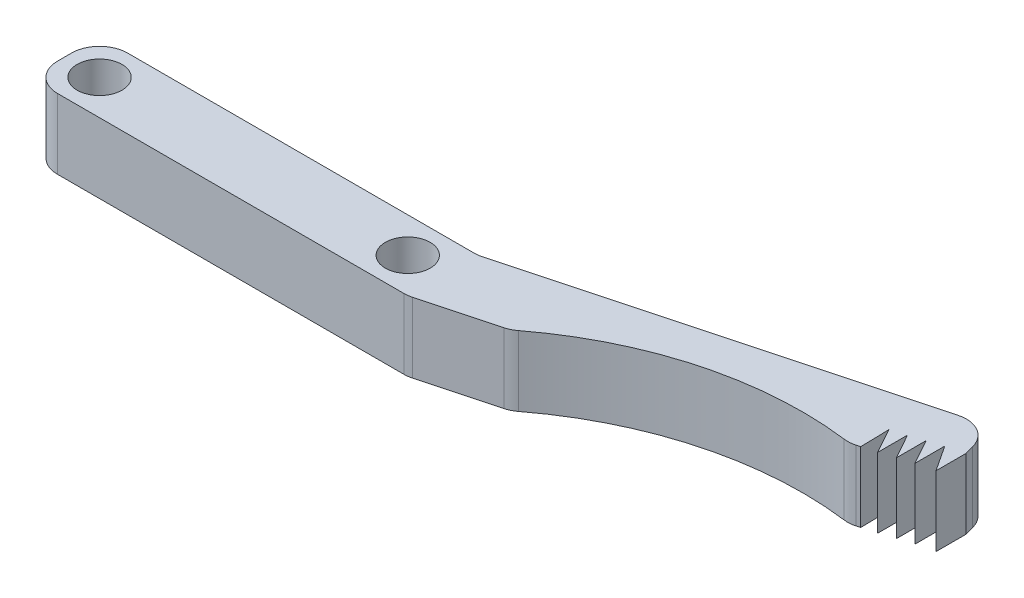
ISO-10303-21;
HEADER;
FILE_DESCRIPTION(('STEP AP214'),'2;1');
FILE_NAME('part.step','',(''),(''),'','','');
FILE_SCHEMA(('AUTOMOTIVE_DESIGN { 1 0 10303 214 1 1 1 1 }'));
ENDSEC;
DATA;
#1=APPLICATION_CONTEXT('core data for automotive mechanical design processes');
#2=APPLICATION_PROTOCOL_DEFINITION('international standard','automotive_design',2000,#1);
#3=PRODUCT_CONTEXT('',#1,'mechanical');
#4=PRODUCT('Part','Part','',(#3));
#5=PRODUCT_RELATED_PRODUCT_CATEGORY('part','',(#4));
#6=PRODUCT_DEFINITION_FORMATION('','',#4);
#7=PRODUCT_DEFINITION_CONTEXT('part definition',#1,'design');
#8=PRODUCT_DEFINITION('design','',#6,#7);
#9=PRODUCT_DEFINITION_SHAPE('','',#8);
#10=(LENGTH_UNIT() NAMED_UNIT(*) SI_UNIT(.MILLI.,.METRE.));
#11=(NAMED_UNIT(*) PLANE_ANGLE_UNIT() SI_UNIT($,.RADIAN.));
#12=(NAMED_UNIT(*) SI_UNIT($,.STERADIAN.) SOLID_ANGLE_UNIT());
#13=UNCERTAINTY_MEASURE_WITH_UNIT(LENGTH_MEASURE(1.E-05),#10,'distance_accuracy_value','');
#14=(GEOMETRIC_REPRESENTATION_CONTEXT(3) GLOBAL_UNCERTAINTY_ASSIGNED_CONTEXT((#13)) GLOBAL_UNIT_ASSIGNED_CONTEXT((#10,
#11,#12)) REPRESENTATION_CONTEXT('',''));
#15=CARTESIAN_POINT('',(0.,0.,0.));
#16=DIRECTION('',(0.,0.,1.));
#17=DIRECTION('',(1.,0.,0.));
#18=AXIS2_PLACEMENT_3D('',#15,#16,#17);
#19=CARTESIAN_POINT('',(34.7613242715723,5.,20.5891319448674));
#20=DIRECTION('',(0.,-1.,0.));
#21=DIRECTION('',(0.,0.,-1.));
#22=AXIS2_PLACEMENT_3D('',#19,#20,#21);
#23=PLANE('',#22);
#24=DIRECTION('',(-0.258819045102522,0.,-0.965925826289068));
#25=VECTOR('',#24,1.);
#26=CARTESIAN_POINT('',(42.4777747886721,5.,-10.2645713530757));
#27=LINE('',#26,#25);
#28=CARTESIAN_POINT('',(43.1761884324755,5.,-7.65805614970195));
#29=VERTEX_POINT('',#28);
#30=CARTESIAN_POINT('',(42.9954128788771,5.,-8.33271970049752));
#31=VERTEX_POINT('',#30);
#32=EDGE_CURVE('E246',#29,#31,#27,.T.);
#33=ORIENTED_EDGE('',*,*,#32,.T.);
#34=CARTESIAN_POINT('',(41.063561226299,5.,-7.81508161029247));
#35=DIRECTION('',(0.,-1.,0.));
#36=DIRECTION('',(0.,0.,-1.));
#37=AXIS2_PLACEMENT_3D('',#34,#35,#36);
#38=CIRCLE('',#37,2.);
#39=CARTESIAN_POINT('',(40.5459231360939,5.,-9.74693326287061));
#40=VERTEX_POINT('',#39);
#41=EDGE_CURVE('E355',#31,#40,#38,.F.);
#42=ORIENTED_EDGE('',*,*,#41,.T.);
#43=DIRECTION('',(-0.965925826289068,0.,0.258819045102522));
#44=VECTOR('',#43,1.);
#45=CARTESIAN_POINT('',(13.5,5.,-2.5));
#46=LINE('',#45,#44);
#47=CARTESIAN_POINT('',(13.7543330950302,5.,-2.56814834742186));
#48=VERTEX_POINT('',#47);
#49=EDGE_CURVE('E248',#40,#48,#46,.T.);
#50=ORIENTED_EDGE('',*,*,#49,.T.);
#51=CARTESIAN_POINT('',(13.2366950048252,5.,-4.5));
#52=DIRECTION('',(0.,-1.,0.));
#53=DIRECTION('',(0.,0.,-1.));
#54=AXIS2_PLACEMENT_3D('',#51,#52,#53);
#55=CIRCLE('',#54,2.);
#56=CARTESIAN_POINT('',(13.2366950048252,5.,-2.5));
#57=VERTEX_POINT('',#56);
#58=EDGE_CURVE('E11',#48,#57,#55,.T.);
#59=ORIENTED_EDGE('',*,*,#58,.T.);
#60=DIRECTION('',(-1.,0.,0.));
#61=VECTOR('',#60,1.);
#62=CARTESIAN_POINT('',(-13.5,5.,-2.5));
#63=LINE('',#62,#61);
#64=CARTESIAN_POINT('',(-11.5,5.,-2.5));
#65=VERTEX_POINT('',#64);
#66=EDGE_CURVE('E251',#57,#65,#63,.T.);
#67=ORIENTED_EDGE('',*,*,#66,.T.);
#68=CARTESIAN_POINT('',(-11.5,5.,-0.5));
#69=DIRECTION('',(0.,-1.,0.));
#70=DIRECTION('',(0.,0.,-1.));
#71=AXIS2_PLACEMENT_3D('',#68,#69,#70);
#72=CIRCLE('',#71,2.);
#73=CARTESIAN_POINT('',(-13.5,5.,-0.500000000000001));
#74=VERTEX_POINT('',#73);
#75=EDGE_CURVE('E348',#65,#74,#72,.F.);
#76=ORIENTED_EDGE('',*,*,#75,.T.);
#77=DIRECTION('',(0.,0.,1.));
#78=VECTOR('',#77,1.);
#79=CARTESIAN_POINT('',(-13.5,5.,-2.5));
#80=LINE('',#79,#78);
#81=CARTESIAN_POINT('',(-13.5,5.,0.499999999999999));
#82=VERTEX_POINT('',#81);
#83=EDGE_CURVE('E254',#74,#82,#80,.T.);
#84=ORIENTED_EDGE('',*,*,#83,.T.);
#85=CARTESIAN_POINT('',(-11.5,5.,0.5));
#86=DIRECTION('',(0.,-1.,0.));
#87=DIRECTION('',(0.,0.,-1.));
#88=AXIS2_PLACEMENT_3D('',#85,#86,#87);
#89=CIRCLE('',#88,2.);
#90=CARTESIAN_POINT('',(-11.5,5.,2.5));
#91=VERTEX_POINT('',#90);
#92=EDGE_CURVE('E61',#82,#91,#89,.F.);
#93=ORIENTED_EDGE('',*,*,#92,.T.);
#94=DIRECTION('',(1.,0.,0.));
#95=VECTOR('',#94,1.);
#96=CARTESIAN_POINT('',(-13.5,5.,2.5));
#97=LINE('',#96,#95);
#98=CARTESIAN_POINT('',(13.2366950048252,5.,2.5));
#99=VERTEX_POINT('',#98);
#100=EDGE_CURVE('E256',#91,#99,#97,.T.);
#101=ORIENTED_EDGE('',*,*,#100,.T.);
#102=CARTESIAN_POINT('',(13.2366950048252,5.,0.5));
#103=DIRECTION('',(0.,-1.,0.));
#104=DIRECTION('',(0.,0.,-1.));
#105=AXIS2_PLACEMENT_3D('',#102,#103,#104);
#106=CIRCLE('',#105,2.);
#107=CARTESIAN_POINT('',(13.7543330950302,5.,2.43185165257814));
#108=VERTEX_POINT('',#107);
#109=EDGE_CURVE('E350',#99,#108,#106,.F.);
#110=ORIENTED_EDGE('',*,*,#109,.T.);
#111=DIRECTION('',(0.965925826289068,0.,-0.258819045102522));
#112=VECTOR('',#111,1.);
#113=CARTESIAN_POINT('',(19.2955549577344,5.,0.947085729384871));
#114=LINE('',#113,#112);
#115=CARTESIAN_POINT('',(18.9066616740376,5.,1.05128937069332));
#116=VERTEX_POINT('',#115);
#117=EDGE_CURVE('E299',#108,#116,#114,.T.);
#118=ORIENTED_EDGE('',*,*,#117,.T.);
#119=CARTESIAN_POINT('',(18.3890235838325,5.,-0.88056228188482));
#120=DIRECTION('',(0.,-1.,0.));
#121=DIRECTION('',(0.,0.,-1.));
#122=AXIS2_PLACEMENT_3D('',#119,#120,#121);
#123=CIRCLE('',#122,2.);
#124=CARTESIAN_POINT('',(19.6017865977392,5.,0.709785438615346));
#125=VERTEX_POINT('',#124);
#126=EDGE_CURVE('E352',#116,#125,#123,.F.);
#127=ORIENTED_EDGE('',*,*,#126,.T.);
#128=CARTESIAN_POINT('',(34.7613242715723,5.,20.5891319448674));
#129=DIRECTION('',(0.,-1.,0.));
#130=DIRECTION('',(0.,0.,-1.));
#131=AXIS2_PLACEMENT_3D('',#128,#129,#130);
#132=CIRCLE('',#131,25.);
#133=CARTESIAN_POINT('',(37.9501957536129,5.,-4.20665597709686));
#134=VERTEX_POINT('',#133);
#135=EDGE_CURVE('E212',#125,#134,#132,.T.);
#136=ORIENTED_EDGE('',*,*,#135,.T.);
#137=CARTESIAN_POINT('',(38.2053054721762,5.,-6.190319010854));
#138=DIRECTION('',(0.,-1.,0.));
#139=DIRECTION('',(0.,0.,-1.));
#140=AXIS2_PLACEMENT_3D('',#137,#138,#139);
#141=CIRCLE('',#140,2.);
#142=CARTESIAN_POINT('',(38.7229435623812,5.,-4.25846735827586));
#143=VERTEX_POINT('',#142);
#144=EDGE_CURVE('E208',#134,#143,#141,.F.);
#145=ORIENTED_EDGE('',*,*,#144,.T.);
#146=DIRECTION('',(0.965925826289068,0.,-0.258819045102522));
#147=VECTOR('',#146,1.);
#148=CARTESIAN_POINT('',(39.0009276352453,5.,-4.3329529661085));
#149=LINE('',#148,#147);
#150=CARTESIAN_POINT('',(39.0009276352453,5.,-4.3329529661085));
#151=VERTEX_POINT('',#150);
#152=EDGE_CURVE('E199',#143,#151,#149,.T.);
#153=ORIENTED_EDGE('',*,*,#152,.T.);
#154=DIRECTION('',(-0.0231107143175573,0.,-0.999732911773806));
#155=VECTOR('',#154,1.);
#156=CARTESIAN_POINT('',(39.0009276352453,5.,-4.3329529661085));
#157=LINE('',#156,#155);
#158=CARTESIAN_POINT('',(38.9533575632879,5.,-6.39075896456379));
#159=VERTEX_POINT('',#158);
#160=EDGE_CURVE('E204',#151,#159,#157,.T.);
#161=ORIENTED_EDGE('',*,*,#160,.T.);
#162=DIRECTION('',(0.486678243039881,0.,0.873581300023996));
#163=VECTOR('',#162,1.);
#164=CARTESIAN_POINT('',(38.9533575632879,5.,-6.39075896456379));
#165=LINE('',#164,#163);
#166=CARTESIAN_POINT('',(39.9570492896688,5.,-4.5891449912772));
#167=VERTEX_POINT('',#166);
#168=EDGE_CURVE('E227',#159,#167,#165,.T.);
#169=ORIENTED_EDGE('',*,*,#168,.T.);
#170=DIRECTION('',(0.,0.,-1.));
#171=VECTOR('',#170,1.);
#172=CARTESIAN_POINT('',(39.9570492896688,5.,-4.5891449912772));
#173=LINE('',#172,#171);
#174=CARTESIAN_POINT('',(39.9570492896688,5.,-6.71750053622903));
#175=VERTEX_POINT('',#174);
#176=EDGE_CURVE('E229',#167,#175,#173,.T.);
#177=ORIENTED_EDGE('',*,*,#176,.T.);
#178=DIRECTION('',(0.486678243039881,0.,0.873581300023996));
#179=VECTOR('',#178,1.);
#180=CARTESIAN_POINT('',(39.9570492896688,5.,-6.71750053622903));
#181=LINE('',#180,#179);
#182=CARTESIAN_POINT('',(40.9607410160498,5.,-4.91588656294244));
#183=VERTEX_POINT('',#182);
#184=EDGE_CURVE('E234',#175,#183,#181,.T.);
#185=ORIENTED_EDGE('',*,*,#184,.T.);
#186=DIRECTION('',(0.,0.,-1.));
#187=VECTOR('',#186,1.);
#188=CARTESIAN_POINT('',(40.9607410160498,5.,-4.91588656294244));
#189=LINE('',#188,#187);
#190=CARTESIAN_POINT('',(40.9607410160498,5.,-7.04424210789427));
#191=VERTEX_POINT('',#190);
#192=EDGE_CURVE('E236',#183,#191,#189,.T.);
#193=ORIENTED_EDGE('',*,*,#192,.T.);
#194=DIRECTION('',(0.486678243039882,0.,0.873581300023995));
#195=VECTOR('',#194,1.);
#196=CARTESIAN_POINT('',(40.9607410160498,5.,-7.04424210789427));
#197=LINE('',#196,#195);
#198=CARTESIAN_POINT('',(41.9644327424308,5.,-5.24262813460768));
#199=VERTEX_POINT('',#198);
#200=EDGE_CURVE('E238',#191,#199,#197,.T.);
#201=ORIENTED_EDGE('',*,*,#200,.T.);
#202=DIRECTION('',(0.,0.,-1.));
#203=VECTOR('',#202,1.);
#204=CARTESIAN_POINT('',(41.9644327424308,5.,-5.24262813460768));
#205=LINE('',#204,#203);
#206=CARTESIAN_POINT('',(41.9644327424308,5.,-7.3709836795595));
#207=VERTEX_POINT('',#206);
#208=EDGE_CURVE('E240',#199,#207,#205,.T.);
#209=ORIENTED_EDGE('',*,*,#208,.T.);
#210=DIRECTION('',(0.549738474881785,0.,0.835336823822971));
#211=VECTOR('',#210,1.);
#212=CARTESIAN_POINT('',(41.9644327424308,5.,-7.3709836795595));
#213=LINE('',#212,#211);
#214=CARTESIAN_POINT('',(43.1761884324755,5.,-5.52970060475013));
#215=VERTEX_POINT('',#214);
#216=EDGE_CURVE('E242',#207,#215,#213,.T.);
#217=ORIENTED_EDGE('',*,*,#216,.T.);
#218=DIRECTION('',(0.,0.,-1.));
#219=VECTOR('',#218,1.);
#220=CARTESIAN_POINT('',(43.1761884324755,5.,-5.52970060475013));
#221=LINE('',#220,#219);
#222=EDGE_CURVE('E244',#215,#29,#221,.T.);
#223=ORIENTED_EDGE('',*,*,#222,.T.);
#224=EDGE_LOOP('',(#33,#42,#50,#59,#67,#76,#84,#93,#101,#110,#118,#127,#136,#145,#153,#161,#169,
#177,#185,#193,#201,#209,#217,#223));
#225=FACE_BOUND('',#224,.T.);
#226=CARTESIAN_POINT('',(-11.,5.,0.));
#227=DIRECTION('',(0.,1.,0.));
#228=DIRECTION('',(0.,0.,1.));
#229=AXIS2_PLACEMENT_3D('',#226,#227,#228);
#230=CIRCLE('',#229,1.6);
#231=CARTESIAN_POINT('',(-11.,5.,1.6));
#232=VERTEX_POINT('',#231);
#233=EDGE_CURVE('E263',#232,#232,#230,.T.);
#234=ORIENTED_EDGE('',*,*,#233,.F.);
#235=EDGE_LOOP('',(#234));
#236=FACE_BOUND('',#235,.T.);
#237=CARTESIAN_POINT('',(11.,5.,0.));
#238=DIRECTION('',(0.,1.,0.));
#239=DIRECTION('',(0.,0.,-1.));
#240=AXIS2_PLACEMENT_3D('',#237,#238,#239);
#241=CIRCLE('',#240,1.6);
#242=CARTESIAN_POINT('',(11.,5.,-1.6));
#243=VERTEX_POINT('',#242);
#244=EDGE_CURVE('E424',#243,#243,#241,.T.);
#245=ORIENTED_EDGE('',*,*,#244,.F.);
#246=EDGE_LOOP('',(#245));
#247=FACE_BOUND('',#246,.T.);
#248=ADVANCED_FACE('F39',(#225,#236,#247),#23,.F.);
#249=CARTESIAN_POINT('',(34.7613242715723,0.,20.5891319448674));
#250=DIRECTION('',(0.,-1.,0.));
#251=DIRECTION('',(0.,0.,-1.));
#252=AXIS2_PLACEMENT_3D('',#249,#250,#251);
#253=PLANE('',#252);
#254=CARTESIAN_POINT('',(-11.,0.,0.));
#255=DIRECTION('',(0.,1.,0.));
#256=DIRECTION('',(0.,0.,1.));
#257=AXIS2_PLACEMENT_3D('',#254,#255,#256);
#258=CIRCLE('',#257,1.6);
#259=CARTESIAN_POINT('',(-11.,0.,1.6));
#260=VERTEX_POINT('',#259);
#261=EDGE_CURVE('E421',#260,#260,#258,.T.);
#262=ORIENTED_EDGE('',*,*,#261,.T.);
#263=EDGE_LOOP('',(#262));
#264=FACE_BOUND('',#263,.T.);
#265=DIRECTION('',(-0.965925826289068,0.,0.258819045102522));
#266=VECTOR('',#265,1.);
#267=CARTESIAN_POINT('',(13.5,0.,-2.5));
#268=LINE('',#267,#266);
#269=CARTESIAN_POINT('',(40.5459231360939,0.,-9.74693326287061));
#270=VERTEX_POINT('',#269);
#271=CARTESIAN_POINT('',(13.7543330950302,0.,-2.56814834742186));
#272=VERTEX_POINT('',#271);
#273=EDGE_CURVE('E288',#270,#272,#268,.T.);
#274=ORIENTED_EDGE('',*,*,#273,.F.);
#275=CARTESIAN_POINT('',(41.063561226299,0.,-7.81508161029247));
#276=DIRECTION('',(0.,-1.,0.));
#277=DIRECTION('',(0.,0.,-1.));
#278=AXIS2_PLACEMENT_3D('',#275,#276,#277);
#279=CIRCLE('',#278,2.);
#280=CARTESIAN_POINT('',(42.9954128788771,0.,-8.33271970049752));
#281=VERTEX_POINT('',#280);
#282=EDGE_CURVE('E343',#270,#281,#279,.T.);
#283=ORIENTED_EDGE('',*,*,#282,.T.);
#284=DIRECTION('',(-0.258819045102522,0.,-0.965925826289068));
#285=VECTOR('',#284,1.);
#286=CARTESIAN_POINT('',(42.4777747886721,0.,-10.2645713530757));
#287=LINE('',#286,#285);
#288=CARTESIAN_POINT('',(43.1761884324755,0.,-7.65805614970195));
#289=VERTEX_POINT('',#288);
#290=EDGE_CURVE('E285',#289,#281,#287,.T.);
#291=ORIENTED_EDGE('',*,*,#290,.F.);
#292=DIRECTION('',(0.,0.,-1.));
#293=VECTOR('',#292,1.);
#294=CARTESIAN_POINT('',(43.1761884324755,0.,-5.52970060475013));
#295=LINE('',#294,#293);
#296=CARTESIAN_POINT('',(43.1761884324755,0.,-5.52970060475013));
#297=VERTEX_POINT('',#296);
#298=EDGE_CURVE('E283',#297,#289,#295,.T.);
#299=ORIENTED_EDGE('',*,*,#298,.F.);
#300=DIRECTION('',(0.549738474881785,0.,0.835336823822971));
#301=VECTOR('',#300,1.);
#302=CARTESIAN_POINT('',(41.9644327424308,0.,-7.3709836795595));
#303=LINE('',#302,#301);
#304=CARTESIAN_POINT('',(41.9644327424308,0.,-7.3709836795595));
#305=VERTEX_POINT('',#304);
#306=EDGE_CURVE('E281',#305,#297,#303,.T.);
#307=ORIENTED_EDGE('',*,*,#306,.F.);
#308=DIRECTION('',(0.,0.,-1.));
#309=VECTOR('',#308,1.);
#310=CARTESIAN_POINT('',(41.9644327424308,0.,-5.24262813460768));
#311=LINE('',#310,#309);
#312=CARTESIAN_POINT('',(41.9644327424308,0.,-5.24262813460768));
#313=VERTEX_POINT('',#312);
#314=EDGE_CURVE('E279',#313,#305,#311,.T.);
#315=ORIENTED_EDGE('',*,*,#314,.F.);
#316=DIRECTION('',(0.486678243039882,0.,0.873581300023995));
#317=VECTOR('',#316,1.);
#318=CARTESIAN_POINT('',(40.9607410160498,0.,-7.04424210789427));
#319=LINE('',#318,#317);
#320=CARTESIAN_POINT('',(40.9607410160498,0.,-7.04424210789427));
#321=VERTEX_POINT('',#320);
#322=EDGE_CURVE('E277',#321,#313,#319,.T.);
#323=ORIENTED_EDGE('',*,*,#322,.F.);
#324=DIRECTION('',(0.,0.,-1.));
#325=VECTOR('',#324,1.);
#326=CARTESIAN_POINT('',(40.9607410160498,0.,-4.91588656294244));
#327=LINE('',#326,#325);
#328=CARTESIAN_POINT('',(40.9607410160498,0.,-4.91588656294244));
#329=VERTEX_POINT('',#328);
#330=EDGE_CURVE('E275',#329,#321,#327,.T.);
#331=ORIENTED_EDGE('',*,*,#330,.F.);
#332=DIRECTION('',(0.486678243039881,0.,0.873581300023996));
#333=VECTOR('',#332,1.);
#334=CARTESIAN_POINT('',(39.9570492896688,0.,-6.71750053622903));
#335=LINE('',#334,#333);
#336=CARTESIAN_POINT('',(39.9570492896688,0.,-6.71750053622903));
#337=VERTEX_POINT('',#336);
#338=EDGE_CURVE('E273',#337,#329,#335,.T.);
#339=ORIENTED_EDGE('',*,*,#338,.F.);
#340=DIRECTION('',(0.,0.,-1.));
#341=VECTOR('',#340,1.);
#342=CARTESIAN_POINT('',(39.9570492896688,0.,-4.5891449912772));
#343=LINE('',#342,#341);
#344=CARTESIAN_POINT('',(39.9570492896688,0.,-4.5891449912772));
#345=VERTEX_POINT('',#344);
#346=EDGE_CURVE('E271',#345,#337,#343,.T.);
#347=ORIENTED_EDGE('',*,*,#346,.F.);
#348=DIRECTION('',(0.486678243039881,0.,0.873581300023996));
#349=VECTOR('',#348,1.);
#350=CARTESIAN_POINT('',(38.9533575632879,0.,-6.39075896456379));
#351=LINE('',#350,#349);
#352=CARTESIAN_POINT('',(38.9533575632879,0.,-6.39075896456379));
#353=VERTEX_POINT('',#352);
#354=EDGE_CURVE('E269',#353,#345,#351,.T.);
#355=ORIENTED_EDGE('',*,*,#354,.F.);
#356=DIRECTION('',(-0.0231107143175573,0.,-0.999732911773806));
#357=VECTOR('',#356,1.);
#358=CARTESIAN_POINT('',(39.0009276352453,0.,-4.3329529661085));
#359=LINE('',#358,#357);
#360=CARTESIAN_POINT('',(39.0009276352453,0.,-4.3329529661085));
#361=VERTEX_POINT('',#360);
#362=EDGE_CURVE('E267',#361,#353,#359,.T.);
#363=ORIENTED_EDGE('',*,*,#362,.F.);
#364=DIRECTION('',(0.965925826289068,0.,-0.258819045102522));
#365=VECTOR('',#364,1.);
#366=CARTESIAN_POINT('',(39.0009276352453,0.,-4.3329529661085));
#367=LINE('',#366,#365);
#368=CARTESIAN_POINT('',(38.7229435623812,0.,-4.25846735827586));
#369=VERTEX_POINT('',#368);
#370=EDGE_CURVE('E218',#369,#361,#367,.T.);
#371=ORIENTED_EDGE('',*,*,#370,.F.);
#372=CARTESIAN_POINT('',(38.2053054721762,0.,-6.190319010854));
#373=DIRECTION('',(0.,-1.,0.));
#374=DIRECTION('',(0.,0.,-1.));
#375=AXIS2_PLACEMENT_3D('',#372,#373,#374);
#376=CIRCLE('',#375,2.);
#377=CARTESIAN_POINT('',(37.9501957536129,0.,-4.20665597709686));
#378=VERTEX_POINT('',#377);
#379=EDGE_CURVE('E341',#369,#378,#376,.T.);
#380=ORIENTED_EDGE('',*,*,#379,.T.);
#381=CARTESIAN_POINT('',(34.7613242715723,0.,20.5891319448674));
#382=DIRECTION('',(0.,-1.,0.));
#383=DIRECTION('',(0.,0.,-1.));
#384=AXIS2_PLACEMENT_3D('',#381,#382,#383);
#385=CIRCLE('',#384,25.);
#386=CARTESIAN_POINT('',(19.6017865977392,0.,0.709785438615346));
#387=VERTEX_POINT('',#386);
#388=EDGE_CURVE('E262',#387,#378,#385,.T.);
#389=ORIENTED_EDGE('',*,*,#388,.F.);
#390=CARTESIAN_POINT('',(18.3890235838325,0.,-0.88056228188482));
#391=DIRECTION('',(0.,-1.,0.));
#392=DIRECTION('',(0.,0.,-1.));
#393=AXIS2_PLACEMENT_3D('',#390,#391,#392);
#394=CIRCLE('',#393,2.);
#395=CARTESIAN_POINT('',(18.9066616740376,0.,1.05128937069332));
#396=VERTEX_POINT('',#395);
#397=EDGE_CURVE('E339',#387,#396,#394,.T.);
#398=ORIENTED_EDGE('',*,*,#397,.T.);
#399=DIRECTION('',(0.965925826289068,0.,-0.258819045102522));
#400=VECTOR('',#399,1.);
#401=CARTESIAN_POINT('',(19.2955549577344,0.,0.947085729384871));
#402=LINE('',#401,#400);
#403=CARTESIAN_POINT('',(13.7543330950302,0.,2.43185165257814));
#404=VERTEX_POINT('',#403);
#405=EDGE_CURVE('E259',#404,#396,#402,.T.);
#406=ORIENTED_EDGE('',*,*,#405,.F.);
#407=CARTESIAN_POINT('',(13.2366950048252,0.,0.5));
#408=DIRECTION('',(0.,-1.,0.));
#409=DIRECTION('',(0.,0.,-1.));
#410=AXIS2_PLACEMENT_3D('',#407,#408,#409);
#411=CIRCLE('',#410,2.);
#412=CARTESIAN_POINT('',(13.2366950048252,0.,2.5));
#413=VERTEX_POINT('',#412);
#414=EDGE_CURVE('E337',#404,#413,#411,.T.);
#415=ORIENTED_EDGE('',*,*,#414,.T.);
#416=DIRECTION('',(1.,0.,0.));
#417=VECTOR('',#416,1.);
#418=CARTESIAN_POINT('',(-13.5,0.,2.5));
#419=LINE('',#418,#417);
#420=CARTESIAN_POINT('',(-11.5,0.,2.5));
#421=VERTEX_POINT('',#420);
#422=EDGE_CURVE('E297',#421,#413,#419,.T.);
#423=ORIENTED_EDGE('',*,*,#422,.F.);
#424=CARTESIAN_POINT('',(-11.5,0.,0.5));
#425=DIRECTION('',(0.,-1.,0.));
#426=DIRECTION('',(0.,0.,-1.));
#427=AXIS2_PLACEMENT_3D('',#424,#425,#426);
#428=CIRCLE('',#427,2.);
#429=CARTESIAN_POINT('',(-13.5,0.,0.499999999999999));
#430=VERTEX_POINT('',#429);
#431=EDGE_CURVE('E333',#421,#430,#428,.T.);
#432=ORIENTED_EDGE('',*,*,#431,.T.);
#433=DIRECTION('',(0.,0.,1.));
#434=VECTOR('',#433,1.);
#435=CARTESIAN_POINT('',(-13.5,0.,-2.5));
#436=LINE('',#435,#434);
#437=CARTESIAN_POINT('',(-13.5,0.,-0.500000000000001));
#438=VERTEX_POINT('',#437);
#439=EDGE_CURVE('E294',#438,#430,#436,.T.);
#440=ORIENTED_EDGE('',*,*,#439,.F.);
#441=CARTESIAN_POINT('',(-11.5,0.,-0.5));
#442=DIRECTION('',(0.,-1.,0.));
#443=DIRECTION('',(0.,0.,-1.));
#444=AXIS2_PLACEMENT_3D('',#441,#442,#443);
#445=CIRCLE('',#444,2.);
#446=CARTESIAN_POINT('',(-11.5,0.,-2.5));
#447=VERTEX_POINT('',#446);
#448=EDGE_CURVE('E335',#438,#447,#445,.T.);
#449=ORIENTED_EDGE('',*,*,#448,.T.);
#450=DIRECTION('',(-1.,0.,0.));
#451=VECTOR('',#450,1.);
#452=CARTESIAN_POINT('',(-13.5,0.,-2.5));
#453=LINE('',#452,#451);
#454=CARTESIAN_POINT('',(13.2366950048252,0.,-2.5));
#455=VERTEX_POINT('',#454);
#456=EDGE_CURVE('E291',#455,#447,#453,.T.);
#457=ORIENTED_EDGE('',*,*,#456,.F.);
#458=CARTESIAN_POINT('',(13.2366950048252,0.,-4.5));
#459=DIRECTION('',(0.,-1.,0.));
#460=DIRECTION('',(0.,0.,-1.));
#461=AXIS2_PLACEMENT_3D('',#458,#459,#460);
#462=CIRCLE('',#461,2.);
#463=EDGE_CURVE('E47',#455,#272,#462,.F.);
#464=ORIENTED_EDGE('',*,*,#463,.T.);
#465=EDGE_LOOP('',(#274,#283,#291,#299,#307,#315,#323,#331,#339,#347,#355,#363,#371,#380,#389,
#398,#406,#415,#423,#432,#440,#449,#457,#464));
#466=FACE_BOUND('',#465,.T.);
#467=CARTESIAN_POINT('',(11.,0.,0.));
#468=DIRECTION('',(0.,1.,0.));
#469=DIRECTION('',(0.,0.,-1.));
#470=AXIS2_PLACEMENT_3D('',#467,#468,#469);
#471=CIRCLE('',#470,1.6);
#472=CARTESIAN_POINT('',(11.,0.,-1.6));
#473=VERTEX_POINT('',#472);
#474=EDGE_CURVE('E427',#473,#473,#471,.T.);
#475=ORIENTED_EDGE('',*,*,#474,.T.);
#476=EDGE_LOOP('',(#475));
#477=FACE_BOUND('',#476,.T.);
#478=ADVANCED_FACE('F380',(#264,#466,#477),#253,.T.);
#479=CARTESIAN_POINT('',(19.2955549577344,5.,0.947085729384871));
#480=DIRECTION('',(-0.258819045102522,0.,-0.965925826289068));
#481=DIRECTION('',(-0.965925826289068,0.,0.258819045102522));
#482=AXIS2_PLACEMENT_3D('',#479,#480,#481);
#483=PLANE('',#482);
#484=ORIENTED_EDGE('',*,*,#405,.T.);
#485=DIRECTION('',(0.,-1.,0.));
#486=VECTOR('',#485,1.);
#487=CARTESIAN_POINT('',(18.9066616740376,5.,1.05128937069332));
#488=LINE('',#487,#486);
#489=EDGE_CURVE('E367',#396,#116,#488,.F.);
#490=ORIENTED_EDGE('',*,*,#489,.T.);
#491=ORIENTED_EDGE('',*,*,#117,.F.);
#492=DIRECTION('',(0.,-1.,0.));
#493=VECTOR('',#492,1.);
#494=CARTESIAN_POINT('',(13.7543330950302,5.,2.43185165257814));
#495=LINE('',#494,#493);
#496=EDGE_CURVE('E364',#108,#404,#495,.T.);
#497=ORIENTED_EDGE('',*,*,#496,.T.);
#498=EDGE_LOOP('',(#484,#490,#491,#497));
#499=FACE_BOUND('',#498,.T.);
#500=ADVANCED_FACE('F415',(#499),#483,.F.);
#501=CARTESIAN_POINT('',(34.7613242715723,5.,20.5891319448674));
#502=DIRECTION('',(0.,-1.,0.));
#503=DIRECTION('',(0.,0.,-1.));
#504=AXIS2_PLACEMENT_3D('',#501,#502,#503);
#505=CYLINDRICAL_SURFACE('',#504,25.);
#506=ORIENTED_EDGE('',*,*,#388,.T.);
#507=DIRECTION('',(0.,-1.,0.));
#508=VECTOR('',#507,1.);
#509=CARTESIAN_POINT('',(37.9501957536129,5.,-4.20665597709686));
#510=LINE('',#509,#508);
#511=EDGE_CURVE('E362',#378,#134,#510,.F.);
#512=ORIENTED_EDGE('',*,*,#511,.T.);
#513=ORIENTED_EDGE('',*,*,#135,.F.);
#514=DIRECTION('',(0.,-1.,0.));
#515=VECTOR('',#514,1.);
#516=CARTESIAN_POINT('',(19.6017865977392,5.,0.709785438615346));
#517=LINE('',#516,#515);
#518=EDGE_CURVE('E359',#125,#387,#517,.T.);
#519=ORIENTED_EDGE('',*,*,#518,.T.);
#520=EDGE_LOOP('',(#506,#512,#513,#519));
#521=FACE_BOUND('',#520,.T.);
#522=ADVANCED_FACE('F496',(#521),#505,.F.);
#523=CARTESIAN_POINT('',(39.0009276352453,5.,-4.3329529661085));
#524=DIRECTION('',(-0.258819045102522,0.,-0.965925826289068));
#525=DIRECTION('',(-0.965925826289068,0.,0.258819045102522));
#526=AXIS2_PLACEMENT_3D('',#523,#524,#525);
#527=PLANE('',#526);
#528=ORIENTED_EDGE('',*,*,#152,.F.);
#529=DIRECTION('',(0.,-1.,0.));
#530=VECTOR('',#529,1.);
#531=CARTESIAN_POINT('',(38.7229435623812,5.,-4.25846735827586));
#532=LINE('',#531,#530);
#533=EDGE_CURVE('E357',#143,#369,#532,.T.);
#534=ORIENTED_EDGE('',*,*,#533,.T.);
#535=ORIENTED_EDGE('',*,*,#370,.T.);
#536=DIRECTION('',(0.,-1.,0.));
#537=VECTOR('',#536,1.);
#538=CARTESIAN_POINT('',(39.0009276352453,5.,-4.3329529661085));
#539=LINE('',#538,#537);
#540=EDGE_CURVE('E215',#151,#361,#539,.T.);
#541=ORIENTED_EDGE('',*,*,#540,.F.);
#542=EDGE_LOOP('',(#528,#534,#535,#541));
#543=FACE_BOUND('',#542,.T.);
#544=ADVANCED_FACE('F216',(#543),#527,.F.);
#545=CARTESIAN_POINT('',(39.0009276352453,5.,-4.3329529661085));
#546=DIRECTION('',(-0.999732911773806,0.,0.0231107143175573));
#547=DIRECTION('',(0.0231107143175573,0.,0.999732911773806));
#548=AXIS2_PLACEMENT_3D('',#545,#546,#547);
#549=PLANE('',#548);
#550=ORIENTED_EDGE('',*,*,#362,.T.);
#551=DIRECTION('',(0.,-1.,0.));
#552=VECTOR('',#551,1.);
#553=CARTESIAN_POINT('',(38.9533575632879,5.,-6.39075896456379));
#554=LINE('',#553,#552);
#555=EDGE_CURVE('E222',#159,#353,#554,.T.);
#556=ORIENTED_EDGE('',*,*,#555,.F.);
#557=ORIENTED_EDGE('',*,*,#160,.F.);
#558=ORIENTED_EDGE('',*,*,#540,.T.);
#559=EDGE_LOOP('',(#550,#556,#557,#558));
#560=FACE_BOUND('',#559,.T.);
#561=ADVANCED_FACE('F224',(#560),#549,.F.);
#562=CARTESIAN_POINT('',(38.9533575632879,5.,-6.39075896456379));
#563=DIRECTION('',(0.873581300023996,0.,-0.486678243039881));
#564=DIRECTION('',(-0.486678243039881,0.,-0.873581300023996));
#565=AXIS2_PLACEMENT_3D('',#562,#563,#564);
#566=PLANE('',#565);
#567=ORIENTED_EDGE('',*,*,#354,.T.);
#568=DIRECTION('',(0.,-1.,0.));
#569=VECTOR('',#568,1.);
#570=CARTESIAN_POINT('',(39.9570492896688,5.,-4.5891449912772));
#571=LINE('',#570,#569);
#572=EDGE_CURVE('E320',#167,#345,#571,.T.);
#573=ORIENTED_EDGE('',*,*,#572,.F.);
#574=ORIENTED_EDGE('',*,*,#168,.F.);
#575=ORIENTED_EDGE('',*,*,#555,.T.);
#576=EDGE_LOOP('',(#567,#573,#574,#575));
#577=FACE_BOUND('',#576,.T.);
#578=ADVANCED_FACE('F487',(#577),#566,.F.);
#579=CARTESIAN_POINT('',(39.9570492896688,5.,-4.5891449912772));
#580=DIRECTION('',(-1.,0.,0.));
#581=DIRECTION('',(0.,0.,1.));
#582=AXIS2_PLACEMENT_3D('',#579,#580,#581);
#583=PLANE('',#582);
#584=ORIENTED_EDGE('',*,*,#346,.T.);
#585=DIRECTION('',(0.,-1.,0.));
#586=VECTOR('',#585,1.);
#587=CARTESIAN_POINT('',(39.9570492896688,5.,-6.71750053622903));
#588=LINE('',#587,#586);
#589=EDGE_CURVE('E317',#175,#337,#588,.T.);
#590=ORIENTED_EDGE('',*,*,#589,.F.);
#591=ORIENTED_EDGE('',*,*,#176,.F.);
#592=ORIENTED_EDGE('',*,*,#572,.T.);
#593=EDGE_LOOP('',(#584,#590,#591,#592));
#594=FACE_BOUND('',#593,.T.);
#595=ADVANCED_FACE('F483',(#594),#583,.F.);
#596=CARTESIAN_POINT('',(39.9570492896688,5.,-6.71750053622903));
#597=DIRECTION('',(0.873581300023996,0.,-0.486678243039881));
#598=DIRECTION('',(-0.486678243039881,0.,-0.873581300023996));
#599=AXIS2_PLACEMENT_3D('',#596,#597,#598);
#600=PLANE('',#599);
#601=ORIENTED_EDGE('',*,*,#338,.T.);
#602=DIRECTION('',(0.,-1.,0.));
#603=VECTOR('',#602,1.);
#604=CARTESIAN_POINT('',(40.9607410160498,5.,-4.91588656294244));
#605=LINE('',#604,#603);
#606=EDGE_CURVE('E314',#183,#329,#605,.T.);
#607=ORIENTED_EDGE('',*,*,#606,.F.);
#608=ORIENTED_EDGE('',*,*,#184,.F.);
#609=ORIENTED_EDGE('',*,*,#589,.T.);
#610=EDGE_LOOP('',(#601,#607,#608,#609));
#611=FACE_BOUND('',#610,.T.);
#612=ADVANCED_FACE('F479',(#611),#600,.F.);
#613=CARTESIAN_POINT('',(40.9607410160498,5.,-4.91588656294244));
#614=DIRECTION('',(-1.,0.,0.));
#615=DIRECTION('',(0.,0.,1.));
#616=AXIS2_PLACEMENT_3D('',#613,#614,#615);
#617=PLANE('',#616);
#618=ORIENTED_EDGE('',*,*,#330,.T.);
#619=DIRECTION('',(0.,-1.,0.));
#620=VECTOR('',#619,1.);
#621=CARTESIAN_POINT('',(40.9607410160498,5.,-7.04424210789427));
#622=LINE('',#621,#620);
#623=EDGE_CURVE('E311',#191,#321,#622,.T.);
#624=ORIENTED_EDGE('',*,*,#623,.F.);
#625=ORIENTED_EDGE('',*,*,#192,.F.);
#626=ORIENTED_EDGE('',*,*,#606,.T.);
#627=EDGE_LOOP('',(#618,#624,#625,#626));
#628=FACE_BOUND('',#627,.T.);
#629=ADVANCED_FACE('F475',(#628),#617,.F.);
#630=CARTESIAN_POINT('',(40.9607410160498,5.,-7.04424210789427));
#631=DIRECTION('',(0.873581300023995,0.,-0.486678243039882));
#632=DIRECTION('',(-0.486678243039882,0.,-0.873581300023995));
#633=AXIS2_PLACEMENT_3D('',#630,#631,#632);
#634=PLANE('',#633);
#635=ORIENTED_EDGE('',*,*,#322,.T.);
#636=DIRECTION('',(0.,-1.,0.));
#637=VECTOR('',#636,1.);
#638=CARTESIAN_POINT('',(41.9644327424308,5.,-5.24262813460768));
#639=LINE('',#638,#637);
#640=EDGE_CURVE('E308',#199,#313,#639,.T.);
#641=ORIENTED_EDGE('',*,*,#640,.F.);
#642=ORIENTED_EDGE('',*,*,#200,.F.);
#643=ORIENTED_EDGE('',*,*,#623,.T.);
#644=EDGE_LOOP('',(#635,#641,#642,#643));
#645=FACE_BOUND('',#644,.T.);
#646=ADVANCED_FACE('F471',(#645),#634,.F.);
#647=CARTESIAN_POINT('',(41.9644327424308,5.,-5.24262813460768));
#648=DIRECTION('',(-1.,0.,0.));
#649=DIRECTION('',(0.,0.,1.));
#650=AXIS2_PLACEMENT_3D('',#647,#648,#649);
#651=PLANE('',#650);
#652=ORIENTED_EDGE('',*,*,#314,.T.);
#653=DIRECTION('',(0.,-1.,0.));
#654=VECTOR('',#653,1.);
#655=CARTESIAN_POINT('',(41.9644327424308,5.,-7.3709836795595));
#656=LINE('',#655,#654);
#657=EDGE_CURVE('E305',#207,#305,#656,.T.);
#658=ORIENTED_EDGE('',*,*,#657,.F.);
#659=ORIENTED_EDGE('',*,*,#208,.F.);
#660=ORIENTED_EDGE('',*,*,#640,.T.);
#661=EDGE_LOOP('',(#652,#658,#659,#660));
#662=FACE_BOUND('',#661,.T.);
#663=ADVANCED_FACE('F467',(#662),#651,.F.);
#664=CARTESIAN_POINT('',(41.9644327424308,5.,-7.3709836795595));
#665=DIRECTION('',(0.835336823822971,0.,-0.549738474881785));
#666=DIRECTION('',(-0.549738474881785,0.,-0.835336823822971));
#667=AXIS2_PLACEMENT_3D('',#664,#665,#666);
#668=PLANE('',#667);
#669=ORIENTED_EDGE('',*,*,#306,.T.);
#670=DIRECTION('',(0.,-1.,0.));
#671=VECTOR('',#670,1.);
#672=CARTESIAN_POINT('',(43.1761884324755,5.,-5.52970060475013));
#673=LINE('',#672,#671);
#674=EDGE_CURVE('E302',#215,#297,#673,.T.);
#675=ORIENTED_EDGE('',*,*,#674,.F.);
#676=ORIENTED_EDGE('',*,*,#216,.F.);
#677=ORIENTED_EDGE('',*,*,#657,.T.);
#678=EDGE_LOOP('',(#669,#675,#676,#677));
#679=FACE_BOUND('',#678,.T.);
#680=ADVANCED_FACE('F463',(#679),#668,.F.);
#681=CARTESIAN_POINT('',(43.1761884324755,5.,-5.52970060475013));
#682=DIRECTION('',(-1.,0.,0.));
#683=DIRECTION('',(0.,0.,1.));
#684=AXIS2_PLACEMENT_3D('',#681,#682,#683);
#685=PLANE('',#684);
#686=ORIENTED_EDGE('',*,*,#298,.T.);
#687=DIRECTION('',(0.,-1.,0.));
#688=VECTOR('',#687,1.);
#689=CARTESIAN_POINT('',(43.1761884324755,5.,-7.65805614970195));
#690=LINE('',#689,#688);
#691=EDGE_CURVE('E258',#29,#289,#690,.T.);
#692=ORIENTED_EDGE('',*,*,#691,.F.);
#693=ORIENTED_EDGE('',*,*,#222,.F.);
#694=ORIENTED_EDGE('',*,*,#674,.T.);
#695=EDGE_LOOP('',(#686,#692,#693,#694));
#696=FACE_BOUND('',#695,.T.);
#697=ADVANCED_FACE('F459',(#696),#685,.F.);
#698=CARTESIAN_POINT('',(42.4777747886721,5.,-10.2645713530757));
#699=DIRECTION('',(-0.965925826289068,0.,0.258819045102522));
#700=DIRECTION('',(0.258819045102522,0.,0.965925826289068));
#701=AXIS2_PLACEMENT_3D('',#698,#699,#700);
#702=PLANE('',#701);
#703=ORIENTED_EDGE('',*,*,#290,.T.);
#704=DIRECTION('',(0.,-1.,0.));
#705=VECTOR('',#704,1.);
#706=CARTESIAN_POINT('',(42.9954128788771,5.,-8.33271970049752));
#707=LINE('',#706,#705);
#708=EDGE_CURVE('E345',#281,#31,#707,.F.);
#709=ORIENTED_EDGE('',*,*,#708,.T.);
#710=ORIENTED_EDGE('',*,*,#32,.F.);
#711=ORIENTED_EDGE('',*,*,#691,.T.);
#712=EDGE_LOOP('',(#703,#709,#710,#711));
#713=FACE_BOUND('',#712,.T.);
#714=ADVANCED_FACE('F456',(#713),#702,.F.);
#715=CARTESIAN_POINT('',(13.5,5.,-2.5));
#716=DIRECTION('',(0.258819045102522,0.,0.965925826289068));
#717=DIRECTION('',(0.965925826289068,0.,-0.258819045102522));
#718=AXIS2_PLACEMENT_3D('',#715,#716,#717);
#719=PLANE('',#718);
#720=ORIENTED_EDGE('',*,*,#273,.T.);
#721=DIRECTION('',(0.,-1.,0.));
#722=VECTOR('',#721,1.);
#723=CARTESIAN_POINT('',(13.7543330950302,5.,-2.56814834742186));
#724=LINE('',#723,#722);
#725=EDGE_CURVE('E331',#272,#48,#724,.F.);
#726=ORIENTED_EDGE('',*,*,#725,.T.);
#727=ORIENTED_EDGE('',*,*,#49,.F.);
#728=DIRECTION('',(0.,-1.,0.));
#729=VECTOR('',#728,1.);
#730=CARTESIAN_POINT('',(40.5459231360939,5.,-9.74693326287061));
#731=LINE('',#730,#729);
#732=EDGE_CURVE('E328',#40,#270,#731,.T.);
#733=ORIENTED_EDGE('',*,*,#732,.T.);
#734=EDGE_LOOP('',(#720,#726,#727,#733));
#735=FACE_BOUND('',#734,.T.);
#736=ADVANCED_FACE('F386',(#735),#719,.F.);
#737=CARTESIAN_POINT('',(-13.5,5.,-2.5));
#738=DIRECTION('',(0.,0.,1.));
#739=DIRECTION('',(1.,0.,0.));
#740=AXIS2_PLACEMENT_3D('',#737,#738,#739);
#741=PLANE('',#740);
#742=ORIENTED_EDGE('',*,*,#66,.F.);
#743=DIRECTION('',(0.,-1.,0.));
#744=VECTOR('',#743,1.);
#745=CARTESIAN_POINT('',(13.2366950048252,0.,-2.5));
#746=LINE('',#745,#744);
#747=EDGE_CURVE('E325',#57,#455,#746,.T.);
#748=ORIENTED_EDGE('',*,*,#747,.T.);
#749=ORIENTED_EDGE('',*,*,#456,.T.);
#750=DIRECTION('',(0.,-1.,0.));
#751=VECTOR('',#750,1.);
#752=CARTESIAN_POINT('',(-11.5,5.,-2.5));
#753=LINE('',#752,#751);
#754=EDGE_CURVE('E221',#447,#65,#753,.F.);
#755=ORIENTED_EDGE('',*,*,#754,.T.);
#756=EDGE_LOOP('',(#742,#748,#749,#755));
#757=FACE_BOUND('',#756,.T.);
#758=ADVANCED_FACE('F394',(#757),#741,.F.);
#759=CARTESIAN_POINT('',(-13.5,5.,-2.5));
#760=DIRECTION('',(1.,0.,0.));
#761=DIRECTION('',(0.,0.,-1.));
#762=AXIS2_PLACEMENT_3D('',#759,#760,#761);
#763=PLANE('',#762);
#764=ORIENTED_EDGE('',*,*,#83,.F.);
#765=DIRECTION('',(0.,-1.,0.));
#766=VECTOR('',#765,1.);
#767=CARTESIAN_POINT('',(-13.5,5.,-0.500000000000001));
#768=LINE('',#767,#766);
#769=EDGE_CURVE('E375',#74,#438,#768,.T.);
#770=ORIENTED_EDGE('',*,*,#769,.T.);
#771=ORIENTED_EDGE('',*,*,#439,.T.);
#772=DIRECTION('',(0.,-1.,0.));
#773=VECTOR('',#772,1.);
#774=CARTESIAN_POINT('',(-13.5,5.,0.499999999999999));
#775=LINE('',#774,#773);
#776=EDGE_CURVE('E373',#430,#82,#775,.F.);
#777=ORIENTED_EDGE('',*,*,#776,.T.);
#778=EDGE_LOOP('',(#764,#770,#771,#777));
#779=FACE_BOUND('',#778,.T.);
#780=ADVANCED_FACE('F401',(#779),#763,.F.);
#781=CARTESIAN_POINT('',(-13.5,5.,2.5));
#782=DIRECTION('',(0.,0.,-1.));
#783=DIRECTION('',(-1.,0.,0.));
#784=AXIS2_PLACEMENT_3D('',#781,#782,#783);
#785=PLANE('',#784);
#786=ORIENTED_EDGE('',*,*,#422,.T.);
#787=DIRECTION('',(0.,-1.,0.));
#788=VECTOR('',#787,1.);
#789=CARTESIAN_POINT('',(13.2366950048252,5.,2.5));
#790=LINE('',#789,#788);
#791=EDGE_CURVE('E54',#413,#99,#790,.F.);
#792=ORIENTED_EDGE('',*,*,#791,.T.);
#793=ORIENTED_EDGE('',*,*,#100,.F.);
#794=DIRECTION('',(0.,-1.,0.));
#795=VECTOR('',#794,1.);
#796=CARTESIAN_POINT('',(-11.5,5.,2.5));
#797=LINE('',#796,#795);
#798=EDGE_CURVE('E369',#91,#421,#797,.T.);
#799=ORIENTED_EDGE('',*,*,#798,.T.);
#800=EDGE_LOOP('',(#786,#792,#793,#799));
#801=FACE_BOUND('',#800,.T.);
#802=ADVANCED_FACE('F407',(#801),#785,.F.);
#803=CARTESIAN_POINT('',(-11.,5.,0.));
#804=DIRECTION('',(0.,-1.,0.));
#805=DIRECTION('',(0.,0.,-1.));
#806=AXIS2_PLACEMENT_3D('',#803,#804,#805);
#807=CYLINDRICAL_SURFACE('',#806,1.6);
#808=ORIENTED_EDGE('',*,*,#233,.T.);
#809=EDGE_LOOP('',(#808));
#810=FACE_BOUND('',#809,.T.);
#811=ORIENTED_EDGE('',*,*,#261,.F.);
#812=EDGE_LOOP('',(#811));
#813=FACE_BOUND('',#812,.T.);
#814=ADVANCED_FACE('F445',(#810,#813),#807,.F.);
#815=CARTESIAN_POINT('',(11.,5.,0.));
#816=DIRECTION('',(0.,-1.,0.));
#817=DIRECTION('',(0.,0.,-1.));
#818=AXIS2_PLACEMENT_3D('',#815,#816,#817);
#819=CYLINDRICAL_SURFACE('',#818,1.6);
#820=ORIENTED_EDGE('',*,*,#244,.T.);
#821=EDGE_LOOP('',(#820));
#822=FACE_BOUND('',#821,.T.);
#823=ORIENTED_EDGE('',*,*,#474,.F.);
#824=EDGE_LOOP('',(#823));
#825=FACE_BOUND('',#824,.T.);
#826=ADVANCED_FACE('F433',(#822,#825),#819,.F.);
#827=CARTESIAN_POINT('',(13.2366950048252,5.,-4.5));
#828=DIRECTION('',(0.,1.,0.));
#829=DIRECTION('',(0.,0.,1.));
#830=AXIS2_PLACEMENT_3D('',#827,#828,#829);
#831=CYLINDRICAL_SURFACE('',#830,2.);
#832=ORIENTED_EDGE('',*,*,#58,.F.);
#833=ORIENTED_EDGE('',*,*,#725,.F.);
#834=ORIENTED_EDGE('',*,*,#463,.F.);
#835=ORIENTED_EDGE('',*,*,#747,.F.);
#836=EDGE_LOOP('',(#832,#833,#834,#835));
#837=FACE_BOUND('',#836,.T.);
#838=ADVANCED_FACE('F390',(#837),#831,.F.);
#839=CARTESIAN_POINT('',(41.063561226299,5.,-7.81508161029247));
#840=DIRECTION('',(0.,-1.,0.));
#841=DIRECTION('',(0.,0.,-1.));
#842=AXIS2_PLACEMENT_3D('',#839,#840,#841);
#843=CYLINDRICAL_SURFACE('',#842,2.);
#844=ORIENTED_EDGE('',*,*,#41,.F.);
#845=ORIENTED_EDGE('',*,*,#708,.F.);
#846=ORIENTED_EDGE('',*,*,#282,.F.);
#847=ORIENTED_EDGE('',*,*,#732,.F.);
#848=EDGE_LOOP('',(#844,#845,#846,#847));
#849=FACE_BOUND('',#848,.T.);
#850=ADVANCED_FACE('F504',(#849),#843,.T.);
#851=CARTESIAN_POINT('',(38.2053054721762,5.,-6.190319010854));
#852=DIRECTION('',(0.,-1.,0.));
#853=DIRECTION('',(0.,0.,-1.));
#854=AXIS2_PLACEMENT_3D('',#851,#852,#853);
#855=CYLINDRICAL_SURFACE('',#854,2.);
#856=ORIENTED_EDGE('',*,*,#144,.F.);
#857=ORIENTED_EDGE('',*,*,#511,.F.);
#858=ORIENTED_EDGE('',*,*,#379,.F.);
#859=ORIENTED_EDGE('',*,*,#533,.F.);
#860=EDGE_LOOP('',(#856,#857,#858,#859));
#861=FACE_BOUND('',#860,.T.);
#862=ADVANCED_FACE('F507',(#861),#855,.T.);
#863=CARTESIAN_POINT('',(18.3890235838325,5.,-0.88056228188482));
#864=DIRECTION('',(0.,-1.,0.));
#865=DIRECTION('',(0.,0.,-1.));
#866=AXIS2_PLACEMENT_3D('',#863,#864,#865);
#867=CYLINDRICAL_SURFACE('',#866,2.);
#868=ORIENTED_EDGE('',*,*,#126,.F.);
#869=ORIENTED_EDGE('',*,*,#489,.F.);
#870=ORIENTED_EDGE('',*,*,#397,.F.);
#871=ORIENTED_EDGE('',*,*,#518,.F.);
#872=EDGE_LOOP('',(#868,#869,#870,#871));
#873=FACE_BOUND('',#872,.T.);
#874=ADVANCED_FACE('F511',(#873),#867,.T.);
#875=CARTESIAN_POINT('',(13.2366950048252,5.,0.5));
#876=DIRECTION('',(0.,-1.,0.));
#877=DIRECTION('',(0.,0.,-1.));
#878=AXIS2_PLACEMENT_3D('',#875,#876,#877);
#879=CYLINDRICAL_SURFACE('',#878,2.);
#880=ORIENTED_EDGE('',*,*,#109,.F.);
#881=ORIENTED_EDGE('',*,*,#791,.F.);
#882=ORIENTED_EDGE('',*,*,#414,.F.);
#883=ORIENTED_EDGE('',*,*,#496,.F.);
#884=EDGE_LOOP('',(#880,#881,#882,#883));
#885=FACE_BOUND('',#884,.T.);
#886=ADVANCED_FACE('F412',(#885),#879,.T.);
#887=CARTESIAN_POINT('',(-11.5,5.,-0.5));
#888=DIRECTION('',(0.,-1.,0.));
#889=DIRECTION('',(0.,0.,-1.));
#890=AXIS2_PLACEMENT_3D('',#887,#888,#889);
#891=CYLINDRICAL_SURFACE('',#890,2.);
#892=ORIENTED_EDGE('',*,*,#75,.F.);
#893=ORIENTED_EDGE('',*,*,#754,.F.);
#894=ORIENTED_EDGE('',*,*,#448,.F.);
#895=ORIENTED_EDGE('',*,*,#769,.F.);
#896=EDGE_LOOP('',(#892,#893,#894,#895));
#897=FACE_BOUND('',#896,.T.);
#898=ADVANCED_FACE('F397',(#897),#891,.T.);
#899=CARTESIAN_POINT('',(-11.5,5.,0.5));
#900=DIRECTION('',(0.,-1.,0.));
#901=DIRECTION('',(0.,0.,-1.));
#902=AXIS2_PLACEMENT_3D('',#899,#900,#901);
#903=CYLINDRICAL_SURFACE('',#902,2.);
#904=ORIENTED_EDGE('',*,*,#92,.F.);
#905=ORIENTED_EDGE('',*,*,#776,.F.);
#906=ORIENTED_EDGE('',*,*,#431,.F.);
#907=ORIENTED_EDGE('',*,*,#798,.F.);
#908=EDGE_LOOP('',(#904,#905,#906,#907));
#909=FACE_BOUND('',#908,.T.);
#910=ADVANCED_FACE('F41',(#909),#903,.T.);
#911=CLOSED_SHELL('',(#248,#478,#500,#522,#544,#561,#578,#595,#612,#629,#646,#663,#680,#697,
#714,#736,#758,#780,#802,#814,#826,#838,#850,#862,#874,#886,#898,#910));
#912=MANIFOLD_SOLID_BREP('B2',#911);
#913=ADVANCED_BREP_SHAPE_REPRESENTATION('',(#18,#912),#14);
#914=SHAPE_DEFINITION_REPRESENTATION(#9,#913);
ENDSEC;
END-ISO-10303-21;
